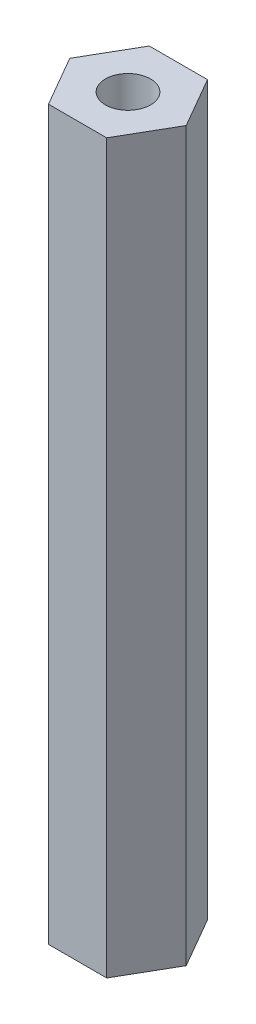
ISO-10303-21;
HEADER;
FILE_DESCRIPTION(('STEP AP214'),'2;1');
FILE_NAME('part.step','',(''),(''),'','','');
FILE_SCHEMA(('AUTOMOTIVE_DESIGN { 1 0 10303 214 1 1 1 1 }'));
ENDSEC;
DATA;
#1=APPLICATION_CONTEXT('core data for automotive mechanical design processes');
#2=APPLICATION_PROTOCOL_DEFINITION('international standard','automotive_design',2000,#1);
#3=PRODUCT_CONTEXT('',#1,'mechanical');
#4=PRODUCT('Part','Part','',(#3));
#5=PRODUCT_RELATED_PRODUCT_CATEGORY('part','',(#4));
#6=PRODUCT_DEFINITION_FORMATION('','',#4);
#7=PRODUCT_DEFINITION_CONTEXT('part definition',#1,'design');
#8=PRODUCT_DEFINITION('design','',#6,#7);
#9=PRODUCT_DEFINITION_SHAPE('','',#8);
#10=(LENGTH_UNIT() NAMED_UNIT(*) SI_UNIT(.MILLI.,.METRE.));
#11=(NAMED_UNIT(*) PLANE_ANGLE_UNIT() SI_UNIT($,.RADIAN.));
#12=(NAMED_UNIT(*) SI_UNIT($,.STERADIAN.) SOLID_ANGLE_UNIT());
#13=UNCERTAINTY_MEASURE_WITH_UNIT(LENGTH_MEASURE(1.E-05),#10,'distance_accuracy_value','');
#14=(GEOMETRIC_REPRESENTATION_CONTEXT(3) GLOBAL_UNCERTAINTY_ASSIGNED_CONTEXT((#13)) GLOBAL_UNIT_ASSIGNED_CONTEXT((#10,
#11,#12)) REPRESENTATION_CONTEXT('',''));
#15=CARTESIAN_POINT('',(0.,0.,0.));
#16=DIRECTION('',(0.,0.,1.));
#17=DIRECTION('',(1.,0.,0.));
#18=AXIS2_PLACEMENT_3D('',#15,#16,#17);
#19=CARTESIAN_POINT('',(0.,50.,0.));
#20=DIRECTION('',(0.,1.,0.));
#21=DIRECTION('',(0.,0.,1.));
#22=AXIS2_PLACEMENT_3D('',#19,#20,#21);
#23=PLANE('',#22);
#24=DIRECTION('',(-0.5,0.,-0.866025403784438));
#25=VECTOR('',#24,1.);
#26=CARTESIAN_POINT('',(4.,50.,0.));
#27=LINE('',#26,#25);
#28=CARTESIAN_POINT('',(4.,50.,0.));
#29=VERTEX_POINT('',#28);
#30=CARTESIAN_POINT('',(2.,50.,-3.46410161513775));
#31=VERTEX_POINT('',#30);
#32=EDGE_CURVE('E167',#29,#31,#27,.T.);
#33=ORIENTED_EDGE('',*,*,#32,.T.);
#34=DIRECTION('',(-1.,0.,0.));
#35=VECTOR('',#34,1.);
#36=CARTESIAN_POINT('',(2.,50.,-3.46410161513775));
#37=LINE('',#36,#35);
#38=CARTESIAN_POINT('',(-2.,50.,-3.46410161513776));
#39=VERTEX_POINT('',#38);
#40=EDGE_CURVE('E115',#31,#39,#37,.T.);
#41=ORIENTED_EDGE('',*,*,#40,.T.);
#42=DIRECTION('',(-0.5,0.,0.866025403784439));
#43=VECTOR('',#42,1.);
#44=CARTESIAN_POINT('',(-2.,50.,-3.46410161513776));
#45=LINE('',#44,#43);
#46=CARTESIAN_POINT('',(-4.,50.,0.));
#47=VERTEX_POINT('',#46);
#48=EDGE_CURVE('E128',#39,#47,#45,.T.);
#49=ORIENTED_EDGE('',*,*,#48,.T.);
#50=DIRECTION('',(0.5,0.,0.866025403784439));
#51=VECTOR('',#50,1.);
#52=CARTESIAN_POINT('',(-4.,50.,0.));
#53=LINE('',#52,#51);
#54=CARTESIAN_POINT('',(-2.,50.,3.46410161513775));
#55=VERTEX_POINT('',#54);
#56=EDGE_CURVE('E122',#47,#55,#53,.T.);
#57=ORIENTED_EDGE('',*,*,#56,.T.);
#58=DIRECTION('',(1.,0.,0.));
#59=VECTOR('',#58,1.);
#60=CARTESIAN_POINT('',(-2.,50.,3.46410161513775));
#61=LINE('',#60,#59);
#62=CARTESIAN_POINT('',(2.,50.,3.46410161513776));
#63=VERTEX_POINT('',#62);
#64=EDGE_CURVE('E126',#55,#63,#61,.T.);
#65=ORIENTED_EDGE('',*,*,#64,.T.);
#66=DIRECTION('',(0.5,0.,-0.866025403784439));
#67=VECTOR('',#66,1.);
#68=CARTESIAN_POINT('',(2.,50.,3.46410161513776));
#69=LINE('',#68,#67);
#70=EDGE_CURVE('E78',#63,#29,#69,.T.);
#71=ORIENTED_EDGE('',*,*,#70,.T.);
#72=EDGE_LOOP('',(#33,#41,#49,#57,#65,#71));
#73=FACE_BOUND('',#72,.T.);
#74=CARTESIAN_POINT('',(0.,50.,0.));
#75=DIRECTION('',(0.,1.,0.));
#76=DIRECTION('',(0.,0.,1.));
#77=AXIS2_PLACEMENT_3D('',#74,#75,#76);
#78=CIRCLE('',#77,1.55);
#79=CARTESIAN_POINT('',(0.,50.,1.55));
#80=VERTEX_POINT('',#79);
#81=EDGE_CURVE('E155',#80,#80,#78,.T.);
#82=ORIENTED_EDGE('',*,*,#81,.F.);
#83=EDGE_LOOP('',(#82));
#84=FACE_BOUND('',#83,.T.);
#85=ADVANCED_FACE('F60',(#73,#84),#23,.T.);
#86=CARTESIAN_POINT('',(0.,0.,0.));
#87=DIRECTION('',(0.,1.,0.));
#88=DIRECTION('',(0.,0.,1.));
#89=AXIS2_PLACEMENT_3D('',#86,#87,#88);
#90=PLANE('',#89);
#91=DIRECTION('',(-0.5,0.,-0.866025403784438));
#92=VECTOR('',#91,1.);
#93=CARTESIAN_POINT('',(4.,0.,0.));
#94=LINE('',#93,#92);
#95=CARTESIAN_POINT('',(4.,0.,0.));
#96=VERTEX_POINT('',#95);
#97=CARTESIAN_POINT('',(2.,0.,-3.46410161513775));
#98=VERTEX_POINT('',#97);
#99=EDGE_CURVE('E150',#96,#98,#94,.T.);
#100=ORIENTED_EDGE('',*,*,#99,.F.);
#101=DIRECTION('',(0.5,0.,-0.866025403784439));
#102=VECTOR('',#101,1.);
#103=CARTESIAN_POINT('',(2.,0.,3.46410161513776));
#104=LINE('',#103,#102);
#105=CARTESIAN_POINT('',(2.,0.,3.46410161513776));
#106=VERTEX_POINT('',#105);
#107=EDGE_CURVE('E107',#106,#96,#104,.T.);
#108=ORIENTED_EDGE('',*,*,#107,.F.);
#109=DIRECTION('',(1.,0.,0.));
#110=VECTOR('',#109,1.);
#111=CARTESIAN_POINT('',(-2.,0.,3.46410161513775));
#112=LINE('',#111,#110);
#113=CARTESIAN_POINT('',(-2.,0.,3.46410161513775));
#114=VERTEX_POINT('',#113);
#115=EDGE_CURVE('E101',#114,#106,#112,.T.);
#116=ORIENTED_EDGE('',*,*,#115,.F.);
#117=DIRECTION('',(0.5,0.,0.866025403784439));
#118=VECTOR('',#117,1.);
#119=CARTESIAN_POINT('',(-4.,0.,0.));
#120=LINE('',#119,#118);
#121=CARTESIAN_POINT('',(-4.,0.,0.));
#122=VERTEX_POINT('',#121);
#123=EDGE_CURVE('E137',#122,#114,#120,.T.);
#124=ORIENTED_EDGE('',*,*,#123,.F.);
#125=DIRECTION('',(-0.5,0.,0.866025403784439));
#126=VECTOR('',#125,1.);
#127=CARTESIAN_POINT('',(-2.,0.,-3.46410161513776));
#128=LINE('',#127,#126);
#129=CARTESIAN_POINT('',(-2.,0.,-3.46410161513776));
#130=VERTEX_POINT('',#129);
#131=EDGE_CURVE('E158',#130,#122,#128,.T.);
#132=ORIENTED_EDGE('',*,*,#131,.F.);
#133=DIRECTION('',(-1.,0.,0.));
#134=VECTOR('',#133,1.);
#135=CARTESIAN_POINT('',(2.,0.,-3.46410161513775));
#136=LINE('',#135,#134);
#137=EDGE_CURVE('E154',#98,#130,#136,.T.);
#138=ORIENTED_EDGE('',*,*,#137,.F.);
#139=EDGE_LOOP('',(#100,#108,#116,#124,#132,#138));
#140=FACE_BOUND('',#139,.T.);
#141=CARTESIAN_POINT('',(0.,0.,0.));
#142=DIRECTION('',(0.,1.,0.));
#143=DIRECTION('',(0.,0.,1.));
#144=AXIS2_PLACEMENT_3D('',#141,#142,#143);
#145=CIRCLE('',#144,1.55);
#146=CARTESIAN_POINT('',(0.,0.,1.55));
#147=VERTEX_POINT('',#146);
#148=EDGE_CURVE('E264',#147,#147,#145,.T.);
#149=ORIENTED_EDGE('',*,*,#148,.T.);
#150=EDGE_LOOP('',(#149));
#151=FACE_BOUND('',#150,.T.);
#152=ADVANCED_FACE('F180',(#140,#151),#90,.F.);
#153=CARTESIAN_POINT('',(4.,50.,0.));
#154=DIRECTION('',(-0.866025403784438,0.,0.5));
#155=DIRECTION('',(0.5,0.,0.866025403784439));
#156=AXIS2_PLACEMENT_3D('',#153,#154,#155);
#157=PLANE('',#156);
#158=ORIENTED_EDGE('',*,*,#99,.T.);
#159=DIRECTION('',(0.,-1.,0.));
#160=VECTOR('',#159,1.);
#161=CARTESIAN_POINT('',(2.,50.,-3.46410161513775));
#162=LINE('',#161,#160);
#163=EDGE_CURVE('E12',#31,#98,#162,.T.);
#164=ORIENTED_EDGE('',*,*,#163,.F.);
#165=ORIENTED_EDGE('',*,*,#32,.F.);
#166=DIRECTION('',(0.,-1.,0.));
#167=VECTOR('',#166,1.);
#168=CARTESIAN_POINT('',(4.,50.,0.));
#169=LINE('',#168,#167);
#170=EDGE_CURVE('E146',#29,#96,#169,.T.);
#171=ORIENTED_EDGE('',*,*,#170,.T.);
#172=EDGE_LOOP('',(#158,#164,#165,#171));
#173=FACE_BOUND('',#172,.T.);
#174=ADVANCED_FACE('F62',(#173),#157,.F.);
#175=CARTESIAN_POINT('',(2.,50.,-3.46410161513775));
#176=DIRECTION('',(0.,0.,1.));
#177=DIRECTION('',(1.,0.,0.));
#178=AXIS2_PLACEMENT_3D('',#175,#176,#177);
#179=PLANE('',#178);
#180=ORIENTED_EDGE('',*,*,#137,.T.);
#181=DIRECTION('',(0.,-1.,0.));
#182=VECTOR('',#181,1.);
#183=CARTESIAN_POINT('',(-2.,50.,-3.46410161513776));
#184=LINE('',#183,#182);
#185=EDGE_CURVE('E70',#39,#130,#184,.T.);
#186=ORIENTED_EDGE('',*,*,#185,.F.);
#187=ORIENTED_EDGE('',*,*,#40,.F.);
#188=ORIENTED_EDGE('',*,*,#163,.T.);
#189=EDGE_LOOP('',(#180,#186,#187,#188));
#190=FACE_BOUND('',#189,.T.);
#191=ADVANCED_FACE('F205',(#190),#179,.F.);
#192=CARTESIAN_POINT('',(-2.,50.,-3.46410161513776));
#193=DIRECTION('',(0.866025403784439,0.,0.5));
#194=DIRECTION('',(0.5,0.,-0.866025403784439));
#195=AXIS2_PLACEMENT_3D('',#192,#193,#194);
#196=PLANE('',#195);
#197=ORIENTED_EDGE('',*,*,#131,.T.);
#198=DIRECTION('',(0.,-1.,0.));
#199=VECTOR('',#198,1.);
#200=CARTESIAN_POINT('',(-4.,50.,0.));
#201=LINE('',#200,#199);
#202=EDGE_CURVE('E139',#47,#122,#201,.T.);
#203=ORIENTED_EDGE('',*,*,#202,.F.);
#204=ORIENTED_EDGE('',*,*,#48,.F.);
#205=ORIENTED_EDGE('',*,*,#185,.T.);
#206=EDGE_LOOP('',(#197,#203,#204,#205));
#207=FACE_BOUND('',#206,.T.);
#208=ADVANCED_FACE('F177',(#207),#196,.F.);
#209=CARTESIAN_POINT('',(-4.,50.,0.));
#210=DIRECTION('',(0.866025403784438,0.,-0.5));
#211=DIRECTION('',(-0.5,0.,-0.866025403784439));
#212=AXIS2_PLACEMENT_3D('',#209,#210,#211);
#213=PLANE('',#212);
#214=ORIENTED_EDGE('',*,*,#123,.T.);
#215=DIRECTION('',(0.,-1.,0.));
#216=VECTOR('',#215,1.);
#217=CARTESIAN_POINT('',(-2.,50.,3.46410161513775));
#218=LINE('',#217,#216);
#219=EDGE_CURVE('E134',#55,#114,#218,.T.);
#220=ORIENTED_EDGE('',*,*,#219,.F.);
#221=ORIENTED_EDGE('',*,*,#56,.F.);
#222=ORIENTED_EDGE('',*,*,#202,.T.);
#223=EDGE_LOOP('',(#214,#220,#221,#222));
#224=FACE_BOUND('',#223,.T.);
#225=ADVANCED_FACE('F135',(#224),#213,.F.);
#226=CARTESIAN_POINT('',(-2.,50.,3.46410161513775));
#227=DIRECTION('',(0.,0.,-1.));
#228=DIRECTION('',(-1.,0.,0.));
#229=AXIS2_PLACEMENT_3D('',#226,#227,#228);
#230=PLANE('',#229);
#231=ORIENTED_EDGE('',*,*,#115,.T.);
#232=DIRECTION('',(0.,-1.,0.));
#233=VECTOR('',#232,1.);
#234=CARTESIAN_POINT('',(2.,50.,3.46410161513776));
#235=LINE('',#234,#233);
#236=EDGE_CURVE('E140',#63,#106,#235,.T.);
#237=ORIENTED_EDGE('',*,*,#236,.F.);
#238=ORIENTED_EDGE('',*,*,#64,.F.);
#239=ORIENTED_EDGE('',*,*,#219,.T.);
#240=EDGE_LOOP('',(#231,#237,#238,#239));
#241=FACE_BOUND('',#240,.T.);
#242=ADVANCED_FACE('F142',(#241),#230,.F.);
#243=CARTESIAN_POINT('',(2.,50.,3.46410161513776));
#244=DIRECTION('',(-0.866025403784439,0.,-0.5));
#245=DIRECTION('',(-0.5,0.,0.866025403784439));
#246=AXIS2_PLACEMENT_3D('',#243,#244,#245);
#247=PLANE('',#246);
#248=ORIENTED_EDGE('',*,*,#107,.T.);
#249=ORIENTED_EDGE('',*,*,#170,.F.);
#250=ORIENTED_EDGE('',*,*,#70,.F.);
#251=ORIENTED_EDGE('',*,*,#236,.T.);
#252=EDGE_LOOP('',(#248,#249,#250,#251));
#253=FACE_BOUND('',#252,.T.);
#254=ADVANCED_FACE('F185',(#253),#247,.F.);
#255=CARTESIAN_POINT('',(0.,50.,0.));
#256=DIRECTION('',(0.,-1.,0.));
#257=DIRECTION('',(0.,0.,-1.));
#258=AXIS2_PLACEMENT_3D('',#255,#256,#257);
#259=CYLINDRICAL_SURFACE('',#258,1.55);
#260=ORIENTED_EDGE('',*,*,#81,.T.);
#261=EDGE_LOOP('',(#260));
#262=FACE_BOUND('',#261,.T.);
#263=ORIENTED_EDGE('',*,*,#148,.F.);
#264=EDGE_LOOP('',(#263));
#265=FACE_BOUND('',#264,.T.);
#266=ADVANCED_FACE('F187',(#262,#265),#259,.F.);
#267=CLOSED_SHELL('',(#85,#152,#174,#191,#208,#225,#242,#254,#266));
#268=MANIFOLD_SOLID_BREP('B2',#267);
#269=ADVANCED_BREP_SHAPE_REPRESENTATION('',(#18,#268),#14);
#270=SHAPE_DEFINITION_REPRESENTATION(#9,#269);
ENDSEC;
END-ISO-10303-21;
